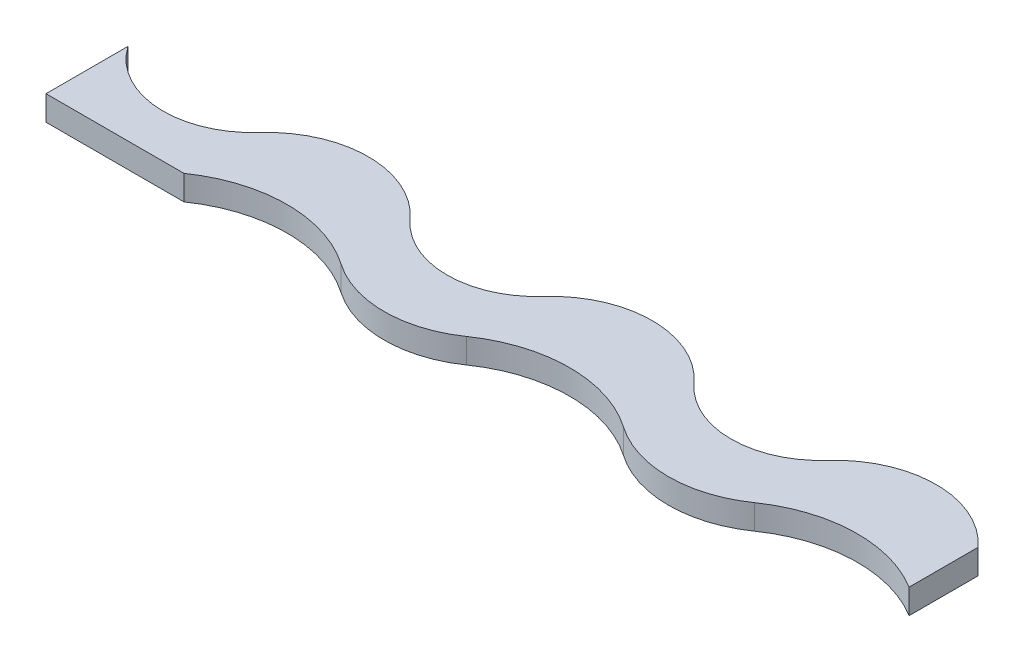
ISO-10303-21;
HEADER;
FILE_DESCRIPTION(('STEP AP214'),'2;1');
FILE_NAME('part.step','',(''),(''),'','','');
FILE_SCHEMA(('AUTOMOTIVE_DESIGN { 1 0 10303 214 1 1 1 1 }'));
ENDSEC;
DATA;
#1=APPLICATION_CONTEXT('core data for automotive mechanical design processes');
#2=APPLICATION_PROTOCOL_DEFINITION('international standard','automotive_design',2000,#1);
#3=PRODUCT_CONTEXT('',#1,'mechanical');
#4=PRODUCT('Part','Part','',(#3));
#5=PRODUCT_RELATED_PRODUCT_CATEGORY('part','',(#4));
#6=PRODUCT_DEFINITION_FORMATION('','',#4);
#7=PRODUCT_DEFINITION_CONTEXT('part definition',#1,'design');
#8=PRODUCT_DEFINITION('design','',#6,#7);
#9=PRODUCT_DEFINITION_SHAPE('','',#8);
#10=(LENGTH_UNIT() NAMED_UNIT(*) SI_UNIT(.MILLI.,.METRE.));
#11=(NAMED_UNIT(*) PLANE_ANGLE_UNIT() SI_UNIT($,.RADIAN.));
#12=(NAMED_UNIT(*) SI_UNIT($,.STERADIAN.) SOLID_ANGLE_UNIT());
#13=UNCERTAINTY_MEASURE_WITH_UNIT(LENGTH_MEASURE(1.E-05),#10,'distance_accuracy_value','');
#14=(GEOMETRIC_REPRESENTATION_CONTEXT(3) GLOBAL_UNCERTAINTY_ASSIGNED_CONTEXT((#13)) GLOBAL_UNIT_ASSIGNED_CONTEXT((#10,
#11,#12)) REPRESENTATION_CONTEXT('',''));
#15=CARTESIAN_POINT('',(0.,0.,0.));
#16=DIRECTION('',(0.,0.,1.));
#17=DIRECTION('',(1.,0.,0.));
#18=AXIS2_PLACEMENT_3D('',#15,#16,#17);
#19=CARTESIAN_POINT('',(0.,2.,0.));
#20=DIRECTION('',(0.,0.,-1.));
#21=DIRECTION('',(-1.,0.,0.));
#22=AXIS2_PLACEMENT_3D('',#19,#20,#21);
#23=PLANE('',#22);
#24=DIRECTION('',(1.,0.,0.));
#25=VECTOR('',#24,1.);
#26=CARTESIAN_POINT('',(0.,0.,0.));
#27=LINE('',#26,#25);
#28=CARTESIAN_POINT('',(0.,0.,0.));
#29=VERTEX_POINT('',#28);
#30=CARTESIAN_POINT('',(11.15,0.,0.));
#31=VERTEX_POINT('',#30);
#32=EDGE_CURVE('E190',#29,#31,#27,.T.);
#33=ORIENTED_EDGE('',*,*,#32,.T.);
#34=DIRECTION('',(0.,-1.,0.));
#35=VECTOR('',#34,1.);
#36=CARTESIAN_POINT('',(11.15,2.,0.));
#37=LINE('',#36,#35);
#38=CARTESIAN_POINT('',(11.15,2.,0.));
#39=VERTEX_POINT('',#38);
#40=EDGE_CURVE('E11',#39,#31,#37,.T.);
#41=ORIENTED_EDGE('',*,*,#40,.F.);
#42=DIRECTION('',(1.,0.,0.));
#43=VECTOR('',#42,1.);
#44=CARTESIAN_POINT('',(0.,2.,0.));
#45=LINE('',#44,#43);
#46=CARTESIAN_POINT('',(0.,2.,0.));
#47=VERTEX_POINT('',#46);
#48=EDGE_CURVE('E237',#47,#39,#45,.T.);
#49=ORIENTED_EDGE('',*,*,#48,.F.);
#50=DIRECTION('',(0.,-1.,0.));
#51=VECTOR('',#50,1.);
#52=CARTESIAN_POINT('',(0.,2.,0.));
#53=LINE('',#52,#51);
#54=EDGE_CURVE('E66',#47,#29,#53,.T.);
#55=ORIENTED_EDGE('',*,*,#54,.T.);
#56=EDGE_LOOP('',(#33,#41,#49,#55));
#57=FACE_BOUND('',#56,.T.);
#58=ADVANCED_FACE('F49',(#57),#23,.F.);
#59=CARTESIAN_POINT('',(17.4988553811659,2.,9.13551642486842));
#60=DIRECTION('',(0.,-1.,0.));
#61=DIRECTION('',(0.,0.,-1.));
#62=AXIS2_PLACEMENT_3D('',#59,#60,#61);
#63=CYLINDRICAL_SURFACE('',#62,11.125);
#64=CARTESIAN_POINT('',(17.4988553811659,0.,9.13551642486842));
#65=DIRECTION('',(0.,-1.,0.));
#66=DIRECTION('',(0.,0.,-1.));
#67=AXIS2_PLACEMENT_3D('',#64,#65,#66);
#68=CIRCLE('',#67,11.125);
#69=CARTESIAN_POINT('',(23.8477107623318,0.,0.));
#70=VERTEX_POINT('',#69);
#71=EDGE_CURVE('E193',#31,#70,#68,.T.);
#72=ORIENTED_EDGE('',*,*,#71,.T.);
#73=DIRECTION('',(0.,-1.,0.));
#74=VECTOR('',#73,1.);
#75=CARTESIAN_POINT('',(23.8477107623318,2.,0.));
#76=LINE('',#75,#74);
#77=CARTESIAN_POINT('',(23.8477107623318,2.,0.));
#78=VERTEX_POINT('',#77);
#79=EDGE_CURVE('E58',#78,#70,#76,.T.);
#80=ORIENTED_EDGE('',*,*,#79,.F.);
#81=CARTESIAN_POINT('',(17.4988553811659,2.,9.13551642486842));
#82=DIRECTION('',(0.,-1.,0.));
#83=DIRECTION('',(0.,0.,-1.));
#84=AXIS2_PLACEMENT_3D('',#81,#82,#83);
#85=CIRCLE('',#84,11.125);
#86=EDGE_CURVE('E123',#39,#78,#85,.T.);
#87=ORIENTED_EDGE('',*,*,#86,.F.);
#88=ORIENTED_EDGE('',*,*,#40,.T.);
#89=EDGE_LOOP('',(#72,#80,#87,#88));
#90=FACE_BOUND('',#89,.T.);
#91=ADVANCED_FACE('F336',(#90),#63,.F.);
#92=CARTESIAN_POINT('',(28.9153813946692,2.,-7.29198973958036));
#93=DIRECTION('',(0.,-1.,0.));
#94=DIRECTION('',(0.,0.,-1.));
#95=AXIS2_PLACEMENT_3D('',#92,#93,#94);
#96=CYLINDRICAL_SURFACE('',#95,8.88);
#97=CARTESIAN_POINT('',(28.9153813946692,0.,-7.29198973958036));
#98=DIRECTION('',(0.,1.,0.));
#99=DIRECTION('',(0.,0.,1.));
#100=AXIS2_PLACEMENT_3D('',#97,#98,#99);
#101=CIRCLE('',#100,8.88);
#102=CARTESIAN_POINT('',(33.9830520270066,0.,0.));
#103=VERTEX_POINT('',#102);
#104=EDGE_CURVE('E196',#70,#103,#101,.T.);
#105=ORIENTED_EDGE('',*,*,#104,.T.);
#106=DIRECTION('',(0.,-1.,0.));
#107=VECTOR('',#106,1.);
#108=CARTESIAN_POINT('',(33.9830520270066,2.,0.));
#109=LINE('',#108,#107);
#110=CARTESIAN_POINT('',(33.9830520270066,2.,0.));
#111=VERTEX_POINT('',#110);
#112=EDGE_CURVE('E268',#111,#103,#109,.T.);
#113=ORIENTED_EDGE('',*,*,#112,.F.);
#114=CARTESIAN_POINT('',(28.9153813946692,2.,-7.29198973958036));
#115=DIRECTION('',(0.,1.,0.));
#116=DIRECTION('',(0.,0.,1.));
#117=AXIS2_PLACEMENT_3D('',#114,#115,#116);
#118=CIRCLE('',#117,8.88);
#119=EDGE_CURVE('E278',#78,#111,#118,.T.);
#120=ORIENTED_EDGE('',*,*,#119,.F.);
#121=ORIENTED_EDGE('',*,*,#79,.T.);
#122=EDGE_LOOP('',(#105,#113,#120,#121));
#123=FACE_BOUND('',#122,.T.);
#124=ADVANCED_FACE('F276',(#123),#96,.T.);
#125=CARTESIAN_POINT('',(40.3319074081725,2.,9.13551642486842));
#126=DIRECTION('',(0.,-1.,0.));
#127=DIRECTION('',(0.,0.,-1.));
#128=AXIS2_PLACEMENT_3D('',#125,#126,#127);
#129=CYLINDRICAL_SURFACE('',#128,11.125);
#130=CARTESIAN_POINT('',(40.3319074081725,0.,9.13551642486842));
#131=DIRECTION('',(0.,-1.,0.));
#132=DIRECTION('',(0.,0.,-1.));
#133=AXIS2_PLACEMENT_3D('',#130,#131,#132);
#134=CIRCLE('',#133,11.125);
#135=CARTESIAN_POINT('',(46.6807627893384,0.,0.));
#136=VERTEX_POINT('',#135);
#137=EDGE_CURVE('E199',#103,#136,#134,.T.);
#138=ORIENTED_EDGE('',*,*,#137,.T.);
#139=DIRECTION('',(0.,-1.,0.));
#140=VECTOR('',#139,1.);
#141=CARTESIAN_POINT('',(46.6807627893384,2.,0.));
#142=LINE('',#141,#140);
#143=CARTESIAN_POINT('',(46.6807627893384,2.,0.));
#144=VERTEX_POINT('',#143);
#145=EDGE_CURVE('E264',#144,#136,#142,.T.);
#146=ORIENTED_EDGE('',*,*,#145,.F.);
#147=CARTESIAN_POINT('',(40.3319074081725,2.,9.13551642486842));
#148=DIRECTION('',(0.,-1.,0.));
#149=DIRECTION('',(0.,0.,-1.));
#150=AXIS2_PLACEMENT_3D('',#147,#148,#149);
#151=CIRCLE('',#150,11.125);
#152=EDGE_CURVE('E296',#111,#144,#151,.T.);
#153=ORIENTED_EDGE('',*,*,#152,.F.);
#154=ORIENTED_EDGE('',*,*,#112,.T.);
#155=EDGE_LOOP('',(#138,#146,#153,#154));
#156=FACE_BOUND('',#155,.T.);
#157=ADVANCED_FACE('F286',(#156),#129,.F.);
#158=CARTESIAN_POINT('',(51.963740366766,2.,-7.60179993609148));
#159=DIRECTION('',(0.,-1.,0.));
#160=DIRECTION('',(0.,0.,-1.));
#161=AXIS2_PLACEMENT_3D('',#158,#159,#160);
#162=CYLINDRICAL_SURFACE('',#161,9.25727899287706);
#163=CARTESIAN_POINT('',(51.963740366766,0.,-7.60179993609148));
#164=DIRECTION('',(0.,1.,0.));
#165=DIRECTION('',(0.,0.,1.));
#166=AXIS2_PLACEMENT_3D('',#163,#164,#165);
#167=CIRCLE('',#166,9.25727899287706);
#168=CARTESIAN_POINT('',(57.2467179441936,0.,0.));
#169=VERTEX_POINT('',#168);
#170=EDGE_CURVE('E202',#136,#169,#167,.T.);
#171=ORIENTED_EDGE('',*,*,#170,.T.);
#172=DIRECTION('',(0.,-1.,0.));
#173=VECTOR('',#172,1.);
#174=CARTESIAN_POINT('',(57.2467179441936,2.,0.));
#175=LINE('',#174,#173);
#176=CARTESIAN_POINT('',(57.2467179441936,2.,0.));
#177=VERTEX_POINT('',#176);
#178=EDGE_CURVE('E260',#177,#169,#175,.T.);
#179=ORIENTED_EDGE('',*,*,#178,.F.);
#180=CARTESIAN_POINT('',(51.963740366766,2.,-7.60179993609148));
#181=DIRECTION('',(0.,1.,0.));
#182=DIRECTION('',(0.,0.,1.));
#183=AXIS2_PLACEMENT_3D('',#180,#181,#182);
#184=CIRCLE('',#183,9.25727899287706);
#185=EDGE_CURVE('E292',#144,#177,#184,.T.);
#186=ORIENTED_EDGE('',*,*,#185,.F.);
#187=ORIENTED_EDGE('',*,*,#145,.T.);
#188=EDGE_LOOP('',(#171,#179,#186,#187));
#189=FACE_BOUND('',#188,.T.);
#190=ADVANCED_FACE('F290',(#189),#162,.T.);
#191=CARTESIAN_POINT('',(63.5955733253595,2.,9.13551642486842));
#192=DIRECTION('',(0.,-1.,0.));
#193=DIRECTION('',(0.,0.,-1.));
#194=AXIS2_PLACEMENT_3D('',#191,#192,#193);
#195=CYLINDRICAL_SURFACE('',#194,11.125);
#196=CARTESIAN_POINT('',(63.5955733253595,0.,9.13551642486842));
#197=DIRECTION('',(0.,-1.,0.));
#198=DIRECTION('',(0.,0.,-1.));
#199=AXIS2_PLACEMENT_3D('',#196,#197,#198);
#200=CIRCLE('',#199,11.125);
#201=CARTESIAN_POINT('',(69.4198862431711,0.,-0.343038530155734));
#202=VERTEX_POINT('',#201);
#203=EDGE_CURVE('E205',#169,#202,#200,.T.);
#204=ORIENTED_EDGE('',*,*,#203,.T.);
#205=DIRECTION('',(0.,-1.,0.));
#206=VECTOR('',#205,1.);
#207=CARTESIAN_POINT('',(69.4198862431711,2.,-0.343038530155734));
#208=LINE('',#207,#206);
#209=CARTESIAN_POINT('',(69.4198862431711,2.,-0.343038530155734));
#210=VERTEX_POINT('',#209);
#211=EDGE_CURVE('E256',#210,#202,#208,.T.);
#212=ORIENTED_EDGE('',*,*,#211,.F.);
#213=CARTESIAN_POINT('',(63.5955733253595,2.,9.13551642486842));
#214=DIRECTION('',(0.,-1.,0.));
#215=DIRECTION('',(0.,0.,-1.));
#216=AXIS2_PLACEMENT_3D('',#213,#214,#215);
#217=CIRCLE('',#216,11.125);
#218=EDGE_CURVE('E295',#177,#210,#217,.T.);
#219=ORIENTED_EDGE('',*,*,#218,.F.);
#220=ORIENTED_EDGE('',*,*,#178,.T.);
#221=EDGE_LOOP('',(#204,#212,#219,#220));
#222=FACE_BOUND('',#221,.T.);
#223=ADVANCED_FACE('F355',(#222),#195,.F.);
#224=CARTESIAN_POINT('',(69.4198862431711,2.,-0.343038530155734));
#225=DIRECTION('',(-1.,0.,0.));
#226=DIRECTION('',(0.,0.,1.));
#227=AXIS2_PLACEMENT_3D('',#224,#225,#226);
#228=PLANE('',#227);
#229=DIRECTION('',(0.,0.,-1.));
#230=VECTOR('',#229,1.);
#231=CARTESIAN_POINT('',(69.4198862431711,0.,-0.343038530155734));
#232=LINE('',#231,#230);
#233=CARTESIAN_POINT('',(69.4198862431711,0.,-5.91000000000001));
#234=VERTEX_POINT('',#233);
#235=EDGE_CURVE('E208',#202,#234,#232,.T.);
#236=ORIENTED_EDGE('',*,*,#235,.T.);
#237=DIRECTION('',(0.,-1.,0.));
#238=VECTOR('',#237,1.);
#239=CARTESIAN_POINT('',(69.4198862431711,2.,-5.91000000000001));
#240=LINE('',#239,#238);
#241=CARTESIAN_POINT('',(69.4198862431711,2.,-5.91000000000001));
#242=VERTEX_POINT('',#241);
#243=EDGE_CURVE('E253',#242,#234,#240,.T.);
#244=ORIENTED_EDGE('',*,*,#243,.F.);
#245=DIRECTION('',(0.,0.,-1.));
#246=VECTOR('',#245,1.);
#247=CARTESIAN_POINT('',(69.4198862431711,2.,-0.343038530155734));
#248=LINE('',#247,#246);
#249=EDGE_CURVE('E300',#210,#242,#248,.T.);
#250=ORIENTED_EDGE('',*,*,#249,.F.);
#251=ORIENTED_EDGE('',*,*,#211,.T.);
#252=EDGE_LOOP('',(#236,#244,#250,#251));
#253=FACE_BOUND('',#252,.T.);
#254=ADVANCED_FACE('F358',(#253),#228,.F.);
#255=CARTESIAN_POINT('',(63.3333020936823,2.,-0.431014103352067));
#256=DIRECTION('',(0.,-1.,0.));
#257=DIRECTION('',(0.,0.,-1.));
#258=AXIS2_PLACEMENT_3D('',#255,#256,#257);
#259=CYLINDRICAL_SURFACE('',#258,8.18937073678282);
#260=CARTESIAN_POINT('',(63.3333020936823,0.,-0.431014103352067));
#261=DIRECTION('',(0.,-1.,0.));
#262=DIRECTION('',(0.,0.,-1.));
#263=AXIS2_PLACEMENT_3D('',#260,#261,#262);
#264=CIRCLE('',#263,8.18937073678282);
#265=CARTESIAN_POINT('',(57.2467179441936,0.,-5.91));
#266=VERTEX_POINT('',#265);
#267=EDGE_CURVE('E212',#266,#234,#264,.T.);
#268=ORIENTED_EDGE('',*,*,#267,.F.);
#269=DIRECTION('',(0.,-1.,0.));
#270=VECTOR('',#269,1.);
#271=CARTESIAN_POINT('',(57.2467179441936,2.,-5.91));
#272=LINE('',#271,#270);
#273=CARTESIAN_POINT('',(57.2467179441936,2.,-5.91));
#274=VERTEX_POINT('',#273);
#275=EDGE_CURVE('E250',#274,#266,#272,.T.);
#276=ORIENTED_EDGE('',*,*,#275,.F.);
#277=CARTESIAN_POINT('',(63.3333020936823,2.,-0.431014103352067));
#278=DIRECTION('',(0.,-1.,0.));
#279=DIRECTION('',(0.,0.,-1.));
#280=AXIS2_PLACEMENT_3D('',#277,#278,#279);
#281=CIRCLE('',#280,8.18937073678282);
#282=EDGE_CURVE('E307',#274,#242,#281,.T.);
#283=ORIENTED_EDGE('',*,*,#282,.T.);
#284=ORIENTED_EDGE('',*,*,#243,.T.);
#285=EDGE_LOOP('',(#268,#276,#283,#284));
#286=FACE_BOUND('',#285,.T.);
#287=ADVANCED_FACE('F362',(#286),#259,.T.);
#288=CARTESIAN_POINT('',(51.8583020936823,2.,-10.7605128205128));
#289=DIRECTION('',(0.,-1.,0.));
#290=DIRECTION('',(0.,0.,-1.));
#291=AXIS2_PLACEMENT_3D('',#288,#289,#290);
#292=CYLINDRICAL_SURFACE('',#291,7.25);
#293=CARTESIAN_POINT('',(51.8583020936823,0.,-10.7605128205128));
#294=DIRECTION('',(0.,1.,0.));
#295=DIRECTION('',(0.,0.,1.));
#296=AXIS2_PLACEMENT_3D('',#293,#294,#295);
#297=CIRCLE('',#296,7.25);
#298=CARTESIAN_POINT('',(46.4698862431711,0.,-5.91));
#299=VERTEX_POINT('',#298);
#300=EDGE_CURVE('E216',#299,#266,#297,.T.);
#301=ORIENTED_EDGE('',*,*,#300,.F.);
#302=DIRECTION('',(0.,-1.,0.));
#303=VECTOR('',#302,1.);
#304=CARTESIAN_POINT('',(46.4698862431711,2.,-5.91));
#305=LINE('',#304,#303);
#306=CARTESIAN_POINT('',(46.4698862431711,2.,-5.91));
#307=VERTEX_POINT('',#306);
#308=EDGE_CURVE('E247',#307,#299,#305,.T.);
#309=ORIENTED_EDGE('',*,*,#308,.F.);
#310=CARTESIAN_POINT('',(51.8583020936823,2.,-10.7605128205128));
#311=DIRECTION('',(0.,1.,0.));
#312=DIRECTION('',(0.,0.,1.));
#313=AXIS2_PLACEMENT_3D('',#310,#311,#312);
#314=CIRCLE('',#313,7.25);
#315=EDGE_CURVE('E311',#307,#274,#314,.T.);
#316=ORIENTED_EDGE('',*,*,#315,.T.);
#317=ORIENTED_EDGE('',*,*,#275,.T.);
#318=EDGE_LOOP('',(#301,#309,#316,#317));
#319=FACE_BOUND('',#318,.T.);
#320=ADVANCED_FACE('F366',(#319),#292,.F.);
#321=CARTESIAN_POINT('',(40.3833020936823,2.,-0.431014103352062));
#322=DIRECTION('',(0.,-1.,0.));
#323=DIRECTION('',(0.,0.,-1.));
#324=AXIS2_PLACEMENT_3D('',#321,#322,#323);
#325=CYLINDRICAL_SURFACE('',#324,8.18937073678282);
#326=CARTESIAN_POINT('',(40.3833020936823,0.,-0.431014103352062));
#327=DIRECTION('',(0.,-1.,0.));
#328=DIRECTION('',(0.,0.,-1.));
#329=AXIS2_PLACEMENT_3D('',#326,#327,#328);
#330=CIRCLE('',#329,8.18937073678282);
#331=CARTESIAN_POINT('',(34.2967179441936,0.,-5.91));
#332=VERTEX_POINT('',#331);
#333=EDGE_CURVE('E220',#332,#299,#330,.T.);
#334=ORIENTED_EDGE('',*,*,#333,.F.);
#335=DIRECTION('',(0.,-1.,0.));
#336=VECTOR('',#335,1.);
#337=CARTESIAN_POINT('',(34.2967179441936,2.,-5.91));
#338=LINE('',#337,#336);
#339=CARTESIAN_POINT('',(34.2967179441936,2.,-5.91));
#340=VERTEX_POINT('',#339);
#341=EDGE_CURVE('E244',#340,#332,#338,.T.);
#342=ORIENTED_EDGE('',*,*,#341,.F.);
#343=CARTESIAN_POINT('',(40.3833020936823,2.,-0.431014103352062));
#344=DIRECTION('',(0.,-1.,0.));
#345=DIRECTION('',(0.,0.,-1.));
#346=AXIS2_PLACEMENT_3D('',#343,#344,#345);
#347=CIRCLE('',#346,8.18937073678282);
#348=EDGE_CURVE('E184',#340,#307,#347,.T.);
#349=ORIENTED_EDGE('',*,*,#348,.T.);
#350=ORIENTED_EDGE('',*,*,#308,.T.);
#351=EDGE_LOOP('',(#334,#342,#349,#350));
#352=FACE_BOUND('',#351,.T.);
#353=ADVANCED_FACE('F318',(#352),#325,.T.);
#354=CARTESIAN_POINT('',(28.9083020936823,2.,-10.7605128205128));
#355=DIRECTION('',(0.,-1.,0.));
#356=DIRECTION('',(0.,0.,-1.));
#357=AXIS2_PLACEMENT_3D('',#354,#355,#356);
#358=CYLINDRICAL_SURFACE('',#357,7.25);
#359=CARTESIAN_POINT('',(28.9083020936823,0.,-10.7605128205128));
#360=DIRECTION('',(0.,1.,0.));
#361=DIRECTION('',(0.,0.,1.));
#362=AXIS2_PLACEMENT_3D('',#359,#360,#361);
#363=CIRCLE('',#362,7.25);
#364=CARTESIAN_POINT('',(23.5198862431711,0.,-5.91));
#365=VERTEX_POINT('',#364);
#366=EDGE_CURVE('E224',#365,#332,#363,.T.);
#367=ORIENTED_EDGE('',*,*,#366,.F.);
#368=DIRECTION('',(0.,-1.,0.));
#369=VECTOR('',#368,1.);
#370=CARTESIAN_POINT('',(23.5198862431711,2.,-5.91));
#371=LINE('',#370,#369);
#372=CARTESIAN_POINT('',(23.5198862431711,2.,-5.91));
#373=VERTEX_POINT('',#372);
#374=EDGE_CURVE('E167',#373,#365,#371,.T.);
#375=ORIENTED_EDGE('',*,*,#374,.F.);
#376=CARTESIAN_POINT('',(28.9083020936823,2.,-10.7605128205128));
#377=DIRECTION('',(0.,1.,0.));
#378=DIRECTION('',(0.,0.,1.));
#379=AXIS2_PLACEMENT_3D('',#376,#377,#378);
#380=CIRCLE('',#379,7.25);
#381=EDGE_CURVE('E180',#373,#340,#380,.T.);
#382=ORIENTED_EDGE('',*,*,#381,.T.);
#383=ORIENTED_EDGE('',*,*,#341,.T.);
#384=EDGE_LOOP('',(#367,#375,#382,#383));
#385=FACE_BOUND('',#384,.T.);
#386=ADVANCED_FACE('F324',(#385),#358,.F.);
#387=CARTESIAN_POINT('',(17.4333020936823,2.,-0.43101410335207));
#388=DIRECTION('',(0.,-1.,0.));
#389=DIRECTION('',(0.,0.,-1.));
#390=AXIS2_PLACEMENT_3D('',#387,#388,#389);
#391=CYLINDRICAL_SURFACE('',#390,8.18937073678281);
#392=CARTESIAN_POINT('',(17.4333020936823,0.,-0.43101410335207));
#393=DIRECTION('',(0.,-1.,0.));
#394=DIRECTION('',(0.,0.,-1.));
#395=AXIS2_PLACEMENT_3D('',#392,#393,#394);
#396=CIRCLE('',#395,8.18937073678281);
#397=CARTESIAN_POINT('',(11.3467179441936,0.,-5.91));
#398=VERTEX_POINT('',#397);
#399=EDGE_CURVE('E163',#398,#365,#396,.T.);
#400=ORIENTED_EDGE('',*,*,#399,.F.);
#401=DIRECTION('',(0.,-1.,0.));
#402=VECTOR('',#401,1.);
#403=CARTESIAN_POINT('',(11.3467179441936,2.,-5.91));
#404=LINE('',#403,#402);
#405=CARTESIAN_POINT('',(11.3467179441936,2.,-5.91));
#406=VERTEX_POINT('',#405);
#407=EDGE_CURVE('E157',#406,#398,#404,.T.);
#408=ORIENTED_EDGE('',*,*,#407,.F.);
#409=CARTESIAN_POINT('',(17.4333020936823,2.,-0.43101410335207));
#410=DIRECTION('',(0.,-1.,0.));
#411=DIRECTION('',(0.,0.,-1.));
#412=AXIS2_PLACEMENT_3D('',#409,#410,#411);
#413=CIRCLE('',#412,8.18937073678281);
#414=EDGE_CURVE('E161',#406,#373,#413,.T.);
#415=ORIENTED_EDGE('',*,*,#414,.T.);
#416=ORIENTED_EDGE('',*,*,#374,.T.);
#417=EDGE_LOOP('',(#400,#408,#415,#416));
#418=FACE_BOUND('',#417,.T.);
#419=ADVANCED_FACE('F159',(#418),#391,.T.);
#420=CARTESIAN_POINT('',(5.95830209368233,2.,-10.7605128205128));
#421=DIRECTION('',(0.,-1.,0.));
#422=DIRECTION('',(0.,0.,-1.));
#423=AXIS2_PLACEMENT_3D('',#420,#421,#422);
#424=CYLINDRICAL_SURFACE('',#423,7.25);
#425=CARTESIAN_POINT('',(5.95830209368233,0.,-10.7605128205128));
#426=DIRECTION('',(0.,-1.,0.));
#427=DIRECTION('',(0.,0.,-1.));
#428=AXIS2_PLACEMENT_3D('',#425,#426,#427);
#429=CIRCLE('',#428,7.25);
#430=CARTESIAN_POINT('',(0.,0.,-6.63));
#431=VERTEX_POINT('',#430);
#432=EDGE_CURVE('E230',#398,#431,#429,.T.);
#433=ORIENTED_EDGE('',*,*,#432,.T.);
#434=DIRECTION('',(0.,-1.,0.));
#435=VECTOR('',#434,1.);
#436=CARTESIAN_POINT('',(0.,2.,-6.63));
#437=LINE('',#436,#435);
#438=CARTESIAN_POINT('',(0.,2.,-6.63));
#439=VERTEX_POINT('',#438);
#440=EDGE_CURVE('E111',#439,#431,#437,.T.);
#441=ORIENTED_EDGE('',*,*,#440,.F.);
#442=CARTESIAN_POINT('',(5.95830209368233,2.,-10.7605128205128));
#443=DIRECTION('',(0.,-1.,0.));
#444=DIRECTION('',(0.,0.,-1.));
#445=AXIS2_PLACEMENT_3D('',#442,#443,#444);
#446=CIRCLE('',#445,7.25);
#447=EDGE_CURVE('E169',#406,#439,#446,.T.);
#448=ORIENTED_EDGE('',*,*,#447,.F.);
#449=ORIENTED_EDGE('',*,*,#407,.T.);
#450=EDGE_LOOP('',(#433,#441,#448,#449));
#451=FACE_BOUND('',#450,.T.);
#452=ADVANCED_FACE('F170',(#451),#424,.F.);
#453=CARTESIAN_POINT('',(0.,2.,0.));
#454=DIRECTION('',(-1.,0.,0.));
#455=DIRECTION('',(0.,0.,1.));
#456=AXIS2_PLACEMENT_3D('',#453,#454,#455);
#457=PLANE('',#456);
#458=DIRECTION('',(0.,0.,-1.));
#459=VECTOR('',#458,1.);
#460=CARTESIAN_POINT('',(0.,0.,0.));
#461=LINE('',#460,#459);
#462=EDGE_CURVE('E233',#29,#431,#461,.T.);
#463=ORIENTED_EDGE('',*,*,#462,.F.);
#464=ORIENTED_EDGE('',*,*,#54,.F.);
#465=DIRECTION('',(0.,0.,-1.));
#466=VECTOR('',#465,1.);
#467=CARTESIAN_POINT('',(0.,2.,0.));
#468=LINE('',#467,#466);
#469=EDGE_CURVE('E174',#47,#439,#468,.T.);
#470=ORIENTED_EDGE('',*,*,#469,.T.);
#471=ORIENTED_EDGE('',*,*,#440,.T.);
#472=EDGE_LOOP('',(#463,#464,#470,#471));
#473=FACE_BOUND('',#472,.T.);
#474=ADVANCED_FACE('F325',(#473),#457,.T.);
#475=CARTESIAN_POINT('',(17.4988553811659,2.,9.13551642486842));
#476=DIRECTION('',(0.,-1.,0.));
#477=DIRECTION('',(0.,0.,-1.));
#478=AXIS2_PLACEMENT_3D('',#475,#476,#477);
#479=PLANE('',#478);
#480=ORIENTED_EDGE('',*,*,#48,.T.);
#481=ORIENTED_EDGE('',*,*,#86,.T.);
#482=ORIENTED_EDGE('',*,*,#119,.T.);
#483=ORIENTED_EDGE('',*,*,#152,.T.);
#484=ORIENTED_EDGE('',*,*,#185,.T.);
#485=ORIENTED_EDGE('',*,*,#218,.T.);
#486=ORIENTED_EDGE('',*,*,#249,.T.);
#487=ORIENTED_EDGE('',*,*,#282,.F.);
#488=ORIENTED_EDGE('',*,*,#315,.F.);
#489=ORIENTED_EDGE('',*,*,#348,.F.);
#490=ORIENTED_EDGE('',*,*,#381,.F.);
#491=ORIENTED_EDGE('',*,*,#414,.F.);
#492=ORIENTED_EDGE('',*,*,#447,.T.);
#493=ORIENTED_EDGE('',*,*,#469,.F.);
#494=EDGE_LOOP('',(#480,#481,#482,#483,#484,#485,#486,#487,#488,#489,#490,#491,#492,#493));
#495=FACE_BOUND('',#494,.T.);
#496=ADVANCED_FACE('F177',(#495),#479,.F.);
#497=CARTESIAN_POINT('',(17.4988553811659,0.,9.13551642486842));
#498=DIRECTION('',(0.,-1.,0.));
#499=DIRECTION('',(0.,0.,-1.));
#500=AXIS2_PLACEMENT_3D('',#497,#498,#499);
#501=PLANE('',#500);
#502=ORIENTED_EDGE('',*,*,#32,.F.);
#503=ORIENTED_EDGE('',*,*,#462,.T.);
#504=ORIENTED_EDGE('',*,*,#432,.F.);
#505=ORIENTED_EDGE('',*,*,#399,.T.);
#506=ORIENTED_EDGE('',*,*,#366,.T.);
#507=ORIENTED_EDGE('',*,*,#333,.T.);
#508=ORIENTED_EDGE('',*,*,#300,.T.);
#509=ORIENTED_EDGE('',*,*,#267,.T.);
#510=ORIENTED_EDGE('',*,*,#235,.F.);
#511=ORIENTED_EDGE('',*,*,#203,.F.);
#512=ORIENTED_EDGE('',*,*,#170,.F.);
#513=ORIENTED_EDGE('',*,*,#137,.F.);
#514=ORIENTED_EDGE('',*,*,#104,.F.);
#515=ORIENTED_EDGE('',*,*,#71,.F.);
#516=EDGE_LOOP('',(#502,#503,#504,#505,#506,#507,#508,#509,#510,#511,#512,#513,#514,#515));
#517=FACE_BOUND('',#516,.T.);
#518=ADVANCED_FACE('F281',(#517),#501,.T.);
#519=CLOSED_SHELL('',(#58,#91,#124,#157,#190,#223,#254,#287,#320,#353,#386,#419,#452,#474,#496,#518));
#520=MANIFOLD_SOLID_BREP('B2',#519);
#521=ADVANCED_BREP_SHAPE_REPRESENTATION('',(#18,#520),#14);
#522=SHAPE_DEFINITION_REPRESENTATION(#9,#521);
ENDSEC;
END-ISO-10303-21;
